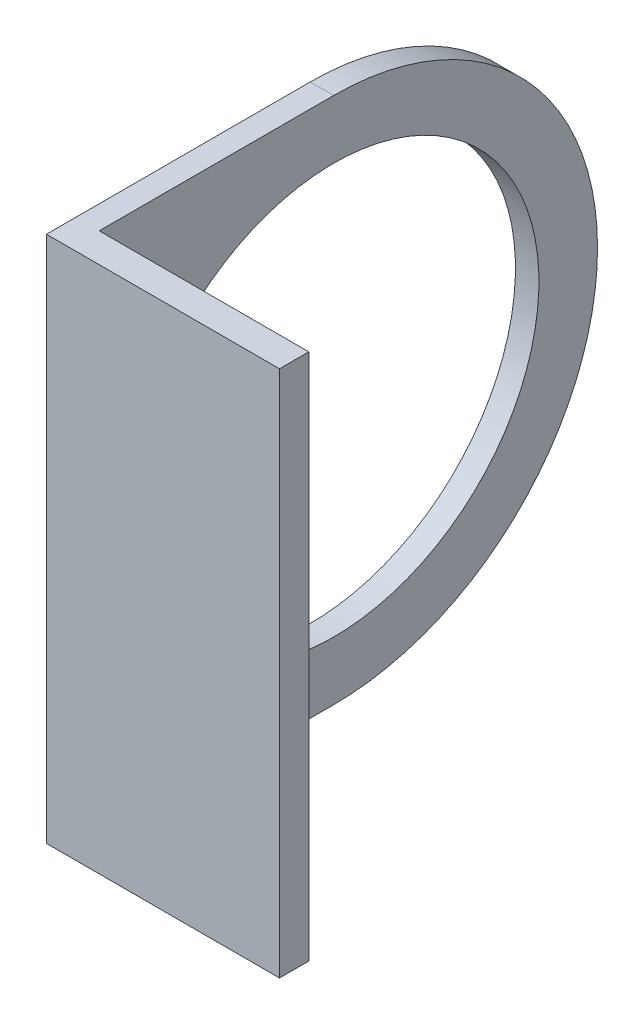
ISO-10303-21;
HEADER;
FILE_DESCRIPTION(('STEP AP214'),'2;1');
FILE_NAME('part.step','',(''),(''),'','','');
FILE_SCHEMA(('AUTOMOTIVE_DESIGN { 1 0 10303 214 1 1 1 1 }'));
ENDSEC;
DATA;
#1=APPLICATION_CONTEXT('core data for automotive mechanical design processes');
#2=APPLICATION_PROTOCOL_DEFINITION('international standard','automotive_design',2000,#1);
#3=PRODUCT_CONTEXT('',#1,'mechanical');
#4=PRODUCT('Part','Part','',(#3));
#5=PRODUCT_RELATED_PRODUCT_CATEGORY('part','',(#4));
#6=PRODUCT_DEFINITION_FORMATION('','',#4);
#7=PRODUCT_DEFINITION_CONTEXT('part definition',#1,'design');
#8=PRODUCT_DEFINITION('design','',#6,#7);
#9=PRODUCT_DEFINITION_SHAPE('','',#8);
#10=(LENGTH_UNIT() NAMED_UNIT(*) SI_UNIT(.MILLI.,.METRE.));
#11=(NAMED_UNIT(*) PLANE_ANGLE_UNIT() SI_UNIT($,.RADIAN.));
#12=(NAMED_UNIT(*) SI_UNIT($,.STERADIAN.) SOLID_ANGLE_UNIT());
#13=UNCERTAINTY_MEASURE_WITH_UNIT(LENGTH_MEASURE(1.E-05),#10,'distance_accuracy_value','');
#14=(GEOMETRIC_REPRESENTATION_CONTEXT(3) GLOBAL_UNCERTAINTY_ASSIGNED_CONTEXT((#13)) GLOBAL_UNIT_ASSIGNED_CONTEXT((#10,
#11,#12)) REPRESENTATION_CONTEXT('',''));
#15=CARTESIAN_POINT('',(0.,0.,0.));
#16=DIRECTION('',(0.,0.,1.));
#17=DIRECTION('',(1.,0.,0.));
#18=AXIS2_PLACEMENT_3D('',#15,#16,#17);
#19=CARTESIAN_POINT('',(7.99999999999997,180.,-10.));
#20=DIRECTION('',(-1.,0.,0.));
#21=DIRECTION('',(0.,0.,-1.));
#22=AXIS2_PLACEMENT_3D('',#19,#20,#21);
#23=PLANE('',#22);
#24=CARTESIAN_POINT('',(7.99999999999998,90.,-90.));
#25=DIRECTION('',(-1.,0.,0.));
#26=DIRECTION('',(0.,0.,1.));
#27=AXIS2_PLACEMENT_3D('',#24,#25,#26);
#28=CIRCLE('',#27,70.);
#29=CARTESIAN_POINT('',(7.99999999999995,90.,-20.));
#30=VERTEX_POINT('',#29);
#31=EDGE_CURVE('E127',#30,#30,#28,.T.);
#32=ORIENTED_EDGE('',*,*,#31,.T.);
#33=EDGE_LOOP('',(#32));
#34=FACE_BOUND('',#33,.T.);
#35=DIRECTION('',(0.,-1.,0.));
#36=VECTOR('',#35,1.);
#37=CARTESIAN_POINT('',(7.99999999999997,180.,-10.));
#38=LINE('',#37,#36);
#39=CARTESIAN_POINT('',(7.99999999999997,180.,-9.99999999999999));
#40=VERTEX_POINT('',#39);
#41=CARTESIAN_POINT('',(7.99999999999997,0.,-9.99999999999998));
#42=VERTEX_POINT('',#41);
#43=EDGE_CURVE('E111',#40,#42,#38,.T.);
#44=ORIENTED_EDGE('',*,*,#43,.T.);
#45=DIRECTION('',(0.,0.,1.));
#46=VECTOR('',#45,1.);
#47=CARTESIAN_POINT('',(7.99999999999997,0.,-10.));
#48=LINE('',#47,#46);
#49=CARTESIAN_POINT('',(7.99999999999998,0.,-90.));
#50=VERTEX_POINT('',#49);
#51=EDGE_CURVE('E107',#50,#42,#48,.T.);
#52=ORIENTED_EDGE('',*,*,#51,.F.);
#53=CARTESIAN_POINT('',(7.99999999999998,90.,-90.));
#54=DIRECTION('',(1.,0.,0.));
#55=DIRECTION('',(0.,0.,1.));
#56=AXIS2_PLACEMENT_3D('',#53,#54,#55);
#57=CIRCLE('',#56,90.);
#58=CARTESIAN_POINT('',(7.99999999999998,180.,-90.));
#59=VERTEX_POINT('',#58);
#60=EDGE_CURVE('E122',#50,#59,#57,.T.);
#61=ORIENTED_EDGE('',*,*,#60,.T.);
#62=DIRECTION('',(0.,0.,1.));
#63=VECTOR('',#62,1.);
#64=CARTESIAN_POINT('',(7.99999999999997,180.,-10.));
#65=LINE('',#64,#63);
#66=EDGE_CURVE('E136',#59,#40,#65,.T.);
#67=ORIENTED_EDGE('',*,*,#66,.T.);
#68=EDGE_LOOP('',(#44,#52,#61,#67));
#69=FACE_BOUND('',#68,.T.);
#70=ADVANCED_FACE('F37',(#34,#69),#23,.F.);
#71=CARTESIAN_POINT('',(0.,180.,0.));
#72=DIRECTION('',(0.,0.,-1.));
#73=DIRECTION('',(1.,0.,0.));
#74=AXIS2_PLACEMENT_3D('',#71,#72,#73);
#75=PLANE('',#74);
#76=DIRECTION('',(-1.,0.,0.));
#77=VECTOR('',#76,1.);
#78=CARTESIAN_POINT('',(0.,0.,0.));
#79=LINE('',#78,#77);
#80=CARTESIAN_POINT('',(79.5,0.,0.));
#81=VERTEX_POINT('',#80);
#82=CARTESIAN_POINT('',(0.,0.,0.));
#83=VERTEX_POINT('',#82);
#84=EDGE_CURVE('E110',#81,#83,#79,.T.);
#85=ORIENTED_EDGE('',*,*,#84,.F.);
#86=DIRECTION('',(0.,1.,0.));
#87=VECTOR('',#86,1.);
#88=CARTESIAN_POINT('',(79.5,180.,0.));
#89=LINE('',#88,#87);
#90=CARTESIAN_POINT('',(79.5,180.,0.));
#91=VERTEX_POINT('',#90);
#92=EDGE_CURVE('E95',#81,#91,#89,.T.);
#93=ORIENTED_EDGE('',*,*,#92,.T.);
#94=DIRECTION('',(-1.,0.,0.));
#95=VECTOR('',#94,1.);
#96=CARTESIAN_POINT('',(0.,180.,0.));
#97=LINE('',#96,#95);
#98=CARTESIAN_POINT('',(0.,180.,0.));
#99=VERTEX_POINT('',#98);
#100=EDGE_CURVE('E100',#91,#99,#97,.T.);
#101=ORIENTED_EDGE('',*,*,#100,.T.);
#102=DIRECTION('',(0.,-1.,0.));
#103=VECTOR('',#102,1.);
#104=CARTESIAN_POINT('',(0.,180.,0.));
#105=LINE('',#104,#103);
#106=EDGE_CURVE('E45',#99,#83,#105,.T.);
#107=ORIENTED_EDGE('',*,*,#106,.T.);
#108=EDGE_LOOP('',(#85,#93,#101,#107));
#109=FACE_BOUND('',#108,.T.);
#110=ADVANCED_FACE('F39',(#109),#75,.F.);
#111=CARTESIAN_POINT('',(0.,180.,-300.));
#112=DIRECTION('',(1.,0.,0.));
#113=DIRECTION('',(0.,0.,1.));
#114=AXIS2_PLACEMENT_3D('',#111,#112,#113);
#115=PLANE('',#114);
#116=CARTESIAN_POINT('',(0.,90.,-90.));
#117=DIRECTION('',(-1.,0.,0.));
#118=DIRECTION('',(0.,0.,1.));
#119=AXIS2_PLACEMENT_3D('',#116,#117,#118);
#120=CIRCLE('',#119,70.);
#121=CARTESIAN_POINT('',(0.,90.,-20.));
#122=VERTEX_POINT('',#121);
#123=EDGE_CURVE('E132',#122,#122,#120,.T.);
#124=ORIENTED_EDGE('',*,*,#123,.F.);
#125=EDGE_LOOP('',(#124));
#126=FACE_BOUND('',#125,.T.);
#127=DIRECTION('',(0.,0.,-1.));
#128=VECTOR('',#127,1.);
#129=CARTESIAN_POINT('',(0.,0.,-300.));
#130=LINE('',#129,#128);
#131=CARTESIAN_POINT('',(0.,0.,-90.));
#132=VERTEX_POINT('',#131);
#133=EDGE_CURVE('E139',#83,#132,#130,.T.);
#134=ORIENTED_EDGE('',*,*,#133,.F.);
#135=ORIENTED_EDGE('',*,*,#106,.F.);
#136=DIRECTION('',(0.,0.,-1.));
#137=VECTOR('',#136,1.);
#138=CARTESIAN_POINT('',(0.,180.,-300.));
#139=LINE('',#138,#137);
#140=CARTESIAN_POINT('',(-1.11022302462516E-13,180.,-90.));
#141=VERTEX_POINT('',#140);
#142=EDGE_CURVE('E103',#99,#141,#139,.T.);
#143=ORIENTED_EDGE('',*,*,#142,.T.);
#144=CARTESIAN_POINT('',(0.,90.,-90.));
#145=DIRECTION('',(-1.,0.,0.));
#146=DIRECTION('',(0.,0.,1.));
#147=AXIS2_PLACEMENT_3D('',#144,#145,#146);
#148=CIRCLE('',#147,90.);
#149=EDGE_CURVE('E130',#132,#141,#148,.F.);
#150=ORIENTED_EDGE('',*,*,#149,.F.);
#151=EDGE_LOOP('',(#134,#135,#143,#150));
#152=FACE_BOUND('',#151,.T.);
#153=ADVANCED_FACE('F153',(#126,#152),#115,.F.);
#154=CARTESIAN_POINT('',(0.,180.,0.));
#155=DIRECTION('',(0.,1.,0.));
#156=DIRECTION('',(0.,0.,-1.));
#157=AXIS2_PLACEMENT_3D('',#154,#155,#156);
#158=PLANE('',#157);
#159=DIRECTION('',(1.,0.,0.));
#160=VECTOR('',#159,1.);
#161=CARTESIAN_POINT('',(-172.,180.,-90.));
#162=LINE('',#161,#160);
#163=EDGE_CURVE('E125',#141,#59,#162,.T.);
#164=ORIENTED_EDGE('',*,*,#163,.F.);
#165=ORIENTED_EDGE('',*,*,#142,.F.);
#166=ORIENTED_EDGE('',*,*,#100,.F.);
#167=DIRECTION('',(0.,0.,-1.));
#168=VECTOR('',#167,1.);
#169=CARTESIAN_POINT('',(79.5,180.,0.));
#170=LINE('',#169,#168);
#171=CARTESIAN_POINT('',(79.5,180.,-10.));
#172=VERTEX_POINT('',#171);
#173=EDGE_CURVE('E90',#91,#172,#170,.T.);
#174=ORIENTED_EDGE('',*,*,#173,.T.);
#175=DIRECTION('',(-1.,0.,0.));
#176=VECTOR('',#175,1.);
#177=CARTESIAN_POINT('',(79.5,180.,-10.));
#178=LINE('',#177,#176);
#179=EDGE_CURVE('E52',#172,#40,#178,.T.);
#180=ORIENTED_EDGE('',*,*,#179,.T.);
#181=ORIENTED_EDGE('',*,*,#66,.F.);
#182=EDGE_LOOP('',(#164,#165,#166,#174,#180,#181));
#183=FACE_BOUND('',#182,.T.);
#184=ADVANCED_FACE('F101',(#183),#158,.T.);
#185=CARTESIAN_POINT('',(0.,0.,0.));
#186=DIRECTION('',(0.,1.,0.));
#187=DIRECTION('',(0.,0.,-1.));
#188=AXIS2_PLACEMENT_3D('',#185,#186,#187);
#189=PLANE('',#188);
#190=ORIENTED_EDGE('',*,*,#51,.T.);
#191=DIRECTION('',(-1.,0.,0.));
#192=VECTOR('',#191,1.);
#193=CARTESIAN_POINT('',(79.5,0.,-9.99999999999998));
#194=LINE('',#193,#192);
#195=CARTESIAN_POINT('',(79.5,0.,-9.99999999999998));
#196=VERTEX_POINT('',#195);
#197=EDGE_CURVE('E118',#196,#42,#194,.T.);
#198=ORIENTED_EDGE('',*,*,#197,.F.);
#199=DIRECTION('',(0.,0.,1.));
#200=VECTOR('',#199,1.);
#201=CARTESIAN_POINT('',(79.5,0.,0.));
#202=LINE('',#201,#200);
#203=EDGE_CURVE('E117',#196,#81,#202,.T.);
#204=ORIENTED_EDGE('',*,*,#203,.T.);
#205=ORIENTED_EDGE('',*,*,#84,.T.);
#206=ORIENTED_EDGE('',*,*,#133,.T.);
#207=DIRECTION('',(1.,0.,0.));
#208=VECTOR('',#207,1.);
#209=CARTESIAN_POINT('',(-172.,0.,-90.));
#210=LINE('',#209,#208);
#211=EDGE_CURVE('E11',#50,#132,#210,.F.);
#212=ORIENTED_EDGE('',*,*,#211,.F.);
#213=EDGE_LOOP('',(#190,#198,#204,#205,#206,#212));
#214=FACE_BOUND('',#213,.T.);
#215=ADVANCED_FACE('F145',(#214),#189,.F.);
#216=CARTESIAN_POINT('',(-172.,90.,-90.));
#217=DIRECTION('',(1.,0.,0.));
#218=DIRECTION('',(0.,0.,1.));
#219=AXIS2_PLACEMENT_3D('',#216,#217,#218);
#220=CYLINDRICAL_SURFACE('',#219,90.);
#221=ORIENTED_EDGE('',*,*,#211,.T.);
#222=ORIENTED_EDGE('',*,*,#149,.T.);
#223=ORIENTED_EDGE('',*,*,#163,.T.);
#224=ORIENTED_EDGE('',*,*,#60,.F.);
#225=EDGE_LOOP('',(#221,#222,#223,#224));
#226=FACE_BOUND('',#225,.T.);
#227=ADVANCED_FACE('F152',(#226),#220,.T.);
#228=CARTESIAN_POINT('',(-172.,90.,-90.));
#229=DIRECTION('',(1.,0.,0.));
#230=DIRECTION('',(0.,0.,1.));
#231=AXIS2_PLACEMENT_3D('',#228,#229,#230);
#232=CYLINDRICAL_SURFACE('',#231,70.);
#233=CARTESIAN_POINT('',(7.99999999999995,90.,-20.));
#234=CARTESIAN_POINT('',(7.91666666666662,90.,-20.));
#235=CARTESIAN_POINT('',(7.83333333333328,90.,-20.));
#236=CARTESIAN_POINT('',(7.66666666666662,90.,-20.));
#237=CARTESIAN_POINT('',(7.58333333333329,90.,-20.));
#238=CARTESIAN_POINT('',(7.41666666666662,90.,-20.));
#239=CARTESIAN_POINT('',(7.33333333333328,90.,-20.));
#240=CARTESIAN_POINT('',(7.16666666666662,90.,-20.));
#241=CARTESIAN_POINT('',(7.08333333333328,90.,-20.));
#242=CARTESIAN_POINT('',(6.91666666666662,90.,-20.));
#243=CARTESIAN_POINT('',(6.83333333333328,90.,-20.));
#244=CARTESIAN_POINT('',(6.66666666666662,90.,-20.));
#245=CARTESIAN_POINT('',(6.58333333333328,90.,-20.));
#246=CARTESIAN_POINT('',(6.41666666666662,90.,-20.));
#247=CARTESIAN_POINT('',(6.33333333333328,90.,-20.));
#248=CARTESIAN_POINT('',(6.16666666666662,90.,-20.));
#249=CARTESIAN_POINT('',(6.08333333333328,90.,-20.));
#250=CARTESIAN_POINT('',(5.91666666666663,90.,-20.));
#251=CARTESIAN_POINT('',(5.8333333333333,90.,-20.));
#252=CARTESIAN_POINT('',(5.66666666666664,90.,-20.));
#253=CARTESIAN_POINT('',(5.58333333333331,90.,-20.));
#254=CARTESIAN_POINT('',(5.41666666666664,90.,-20.));
#255=CARTESIAN_POINT('',(5.33333333333331,90.,-20.));
#256=CARTESIAN_POINT('',(5.16666666666664,90.,-20.));
#257=CARTESIAN_POINT('',(5.08333333333331,90.,-20.));
#258=CARTESIAN_POINT('',(4.91666666666664,90.,-20.));
#259=CARTESIAN_POINT('',(4.83333333333331,90.,-20.));
#260=CARTESIAN_POINT('',(4.66666666666664,90.,-20.));
#261=CARTESIAN_POINT('',(4.58333333333331,90.,-20.));
#262=CARTESIAN_POINT('',(4.41666666666664,90.,-20.));
#263=CARTESIAN_POINT('',(4.33333333333331,90.,-20.));
#264=CARTESIAN_POINT('',(4.16666666666664,90.,-20.));
#265=CARTESIAN_POINT('',(4.08333333333331,90.,-20.));
#266=CARTESIAN_POINT('',(3.91666666666664,90.,-20.));
#267=CARTESIAN_POINT('',(3.83333333333331,90.,-20.));
#268=CARTESIAN_POINT('',(3.66666666666664,90.,-20.));
#269=CARTESIAN_POINT('',(3.58333333333331,90.,-20.));
#270=CARTESIAN_POINT('',(3.41666666666664,90.,-20.));
#271=CARTESIAN_POINT('',(3.33333333333331,90.,-20.));
#272=CARTESIAN_POINT('',(3.16666666666664,90.,-20.));
#273=CARTESIAN_POINT('',(3.08333333333331,90.,-20.));
#274=CARTESIAN_POINT('',(2.91666666666664,90.,-20.));
#275=CARTESIAN_POINT('',(2.83333333333331,90.,-20.));
#276=CARTESIAN_POINT('',(2.66666666666664,90.,-20.));
#277=CARTESIAN_POINT('',(2.58333333333331,90.,-20.));
#278=CARTESIAN_POINT('',(2.41666666666664,90.,-20.));
#279=CARTESIAN_POINT('',(2.33333333333331,90.,-20.));
#280=CARTESIAN_POINT('',(2.16666666666665,90.,-20.));
#281=CARTESIAN_POINT('',(2.08333333333333,90.,-20.));
#282=CARTESIAN_POINT('',(1.91666666666667,90.,-20.));
#283=CARTESIAN_POINT('',(1.83333333333334,90.,-20.));
#284=CARTESIAN_POINT('',(1.66666666666667,90.,-20.));
#285=CARTESIAN_POINT('',(1.58333333333333,90.,-20.));
#286=CARTESIAN_POINT('',(1.41666666666667,90.,-20.));
#287=CARTESIAN_POINT('',(1.33333333333333,90.,-20.));
#288=CARTESIAN_POINT('',(1.16666666666667,90.,-20.));
#289=CARTESIAN_POINT('',(1.08333333333333,90.,-20.));
#290=CARTESIAN_POINT('',(0.916666666666668,90.,-20.));
#291=CARTESIAN_POINT('',(0.833333333333334,90.,-20.));
#292=CARTESIAN_POINT('',(0.666666666666667,90.,-20.));
#293=CARTESIAN_POINT('',(0.583333333333334,90.,-20.));
#294=CARTESIAN_POINT('',(0.416666666666667,90.,-20.));
#295=CARTESIAN_POINT('',(0.333333333333334,90.,-20.));
#296=CARTESIAN_POINT('',(0.166666666666667,90.,-20.));
#297=CARTESIAN_POINT('',(0.0833333333333333,90.,-20.));
#298=CARTESIAN_POINT('',(0.,90.,-20.));
#299=B_SPLINE_CURVE_WITH_KNOTS('',3,(#233,#234,#235,#236,#237,#238,#239,#240,#241,#242,#243,
#244,#245,#246,#247,#248,#249,#250,#251,#252,#253,#254,#255,#256,#257,#258,#259,#260,#261,#262,
#263,#264,#265,#266,#267,#268,#269,#270,#271,#272,#273,#274,#275,#276,#277,#278,#279,#280,#281,
#282,#283,#284,#285,#286,#287,#288,#289,#290,#291,#292,#293,#294,#295,#296,#297,#298),
.UNSPECIFIED.,.F.,.F.,(4,2,2,2,2,2,2,2,2,2,2,2,2,2,2,2,2,2,2,2,2,2,2,2,2,2,2,2,2,2,2,2,4),(0.,
0.25,0.5,0.750000000000001,1.,1.25,1.5,1.75,2.,2.24999999999997,2.49999999999997,
2.74999999999997,2.99999999999998,3.24999999999998,3.49999999999998,3.74999999999998,
3.99999999999998,4.24999999999998,4.49999999999998,4.74999999999998,4.99999999999998,
5.24999999999998,5.49999999999998,5.74999999999998,5.99999999999995,6.24999999999995,
6.49999999999995,6.74999999999995,6.99999999999995,7.24999999999995,7.49999999999995,
7.74999999999995,7.99999999999995),.UNSPECIFIED.);
#300=EDGE_CURVE('BSEAM170',#30,#122,#299,.T.);
#301=ORIENTED_EDGE('',*,*,#31,.F.);
#302=ORIENTED_EDGE('',*,*,#123,.T.);
#303=ORIENTED_EDGE('',*,*,#300,.T.);
#304=ORIENTED_EDGE('',*,*,#300,.F.);
#305=EDGE_LOOP('',(#301,#303,#302,#304));
#306=FACE_BOUND('',#305,.T.);
#307=ADVANCED_FACE('F170',(#306),#232,.F.);
#308=CARTESIAN_POINT('',(79.5,180.,-10.));
#309=DIRECTION('',(0.,0.,1.));
#310=DIRECTION('',(0.,1.,0.));
#311=AXIS2_PLACEMENT_3D('',#308,#309,#310);
#312=PLANE('',#311);
#313=ORIENTED_EDGE('',*,*,#43,.F.);
#314=ORIENTED_EDGE('',*,*,#179,.F.);
#315=DIRECTION('',(0.,-1.,0.));
#316=VECTOR('',#315,1.);
#317=CARTESIAN_POINT('',(79.5,180.,-10.));
#318=LINE('',#317,#316);
#319=EDGE_CURVE('E97',#172,#196,#318,.T.);
#320=ORIENTED_EDGE('',*,*,#319,.T.);
#321=ORIENTED_EDGE('',*,*,#197,.T.);
#322=EDGE_LOOP('',(#313,#314,#320,#321));
#323=FACE_BOUND('',#322,.T.);
#324=ADVANCED_FACE('F150',(#323),#312,.F.);
#325=CARTESIAN_POINT('',(79.5,0.,0.));
#326=DIRECTION('',(-1.,0.,0.));
#327=DIRECTION('',(0.,0.,-1.));
#328=AXIS2_PLACEMENT_3D('',#325,#326,#327);
#329=PLANE('',#328);
#330=ORIENTED_EDGE('',*,*,#92,.F.);
#331=ORIENTED_EDGE('',*,*,#203,.F.);
#332=ORIENTED_EDGE('',*,*,#319,.F.);
#333=ORIENTED_EDGE('',*,*,#173,.F.);
#334=EDGE_LOOP('',(#330,#331,#332,#333));
#335=FACE_BOUND('',#334,.T.);
#336=ADVANCED_FACE('F92',(#335),#329,.F.);
#337=CLOSED_SHELL('',(#70,#110,#153,#184,#215,#227,#307,#324,#336));
#338=MANIFOLD_SOLID_BREP('B2',#337);
#339=ADVANCED_BREP_SHAPE_REPRESENTATION('',(#18,#338),#14);
#340=SHAPE_DEFINITION_REPRESENTATION(#9,#339);
ENDSEC;
END-ISO-10303-21;
